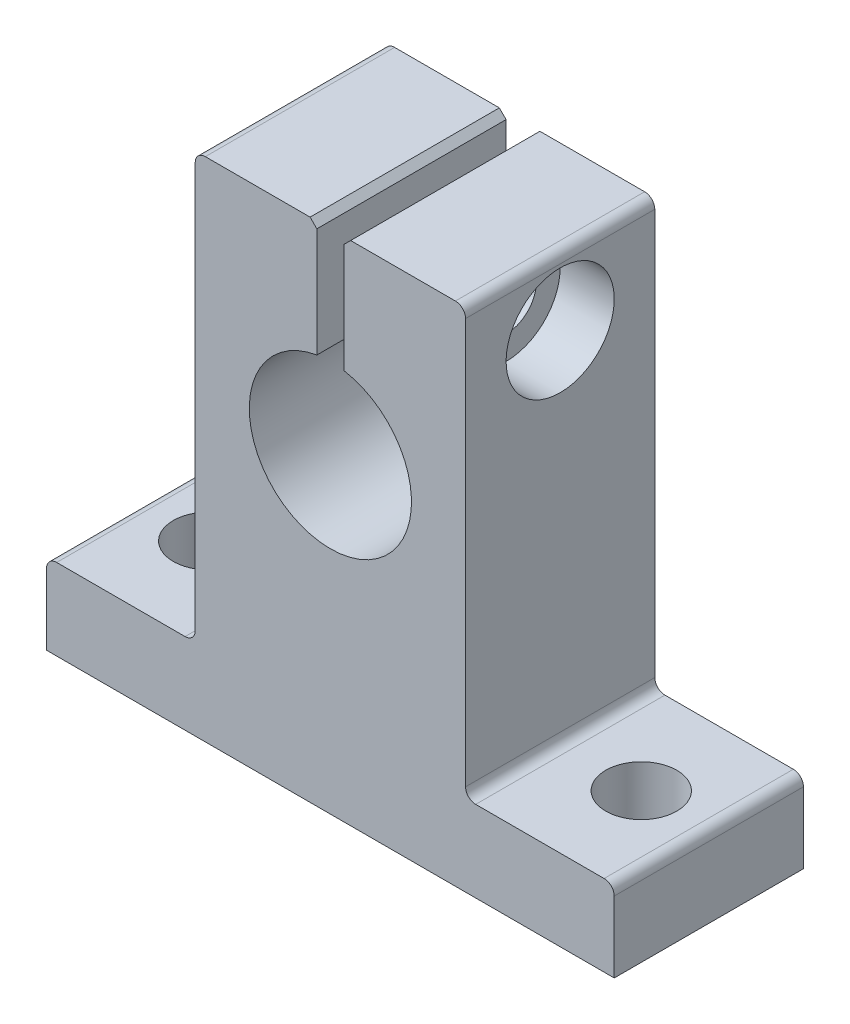
ISO-10303-21;
HEADER;
FILE_DESCRIPTION(('STEP AP214'),'2;1');
FILE_NAME('part.step','',(''),(''),'','','');
FILE_SCHEMA(('AUTOMOTIVE_DESIGN { 1 0 10303 214 1 1 1 1 }'));
ENDSEC;
DATA;
#1=APPLICATION_CONTEXT('core data for automotive mechanical design processes');
#2=APPLICATION_PROTOCOL_DEFINITION('international standard','automotive_design',2000,#1);
#3=PRODUCT_CONTEXT('',#1,'mechanical');
#4=PRODUCT('Part','Part','',(#3));
#5=PRODUCT_RELATED_PRODUCT_CATEGORY('part','',(#4));
#6=PRODUCT_DEFINITION_FORMATION('','',#4);
#7=PRODUCT_DEFINITION_CONTEXT('part definition',#1,'design');
#8=PRODUCT_DEFINITION('design','',#6,#7);
#9=PRODUCT_DEFINITION_SHAPE('','',#8);
#10=(LENGTH_UNIT() NAMED_UNIT(*) SI_UNIT(.MILLI.,.METRE.));
#11=(NAMED_UNIT(*) PLANE_ANGLE_UNIT() SI_UNIT($,.RADIAN.));
#12=(NAMED_UNIT(*) SI_UNIT($,.STERADIAN.) SOLID_ANGLE_UNIT());
#13=UNCERTAINTY_MEASURE_WITH_UNIT(LENGTH_MEASURE(1.E-05),#10,'distance_accuracy_value','');
#14=(GEOMETRIC_REPRESENTATION_CONTEXT(3) GLOBAL_UNCERTAINTY_ASSIGNED_CONTEXT((#13)) GLOBAL_UNIT_ASSIGNED_CONTEXT((#10,
#11,#12)) REPRESENTATION_CONTEXT('',''));
#15=CARTESIAN_POINT('',(0.,0.,0.));
#16=DIRECTION('',(0.,0.,1.));
#17=DIRECTION('',(1.,0.,0.));
#18=AXIS2_PLACEMENT_3D('',#15,#16,#17);
#19=CARTESIAN_POINT('',(10.,0.,14.));
#20=DIRECTION('',(-1.,0.,0.));
#21=DIRECTION('',(0.,-1.,0.));
#22=AXIS2_PLACEMENT_3D('',#19,#20,#21);
#23=PLANE('',#22);
#24=DIRECTION('',(0.,1.,0.));
#25=VECTOR('',#24,1.);
#26=CARTESIAN_POINT('',(10.,0.,14.));
#27=LINE('',#26,#25);
#28=CARTESIAN_POINT('',(10.,6.75,14.));
#29=VERTEX_POINT('',#28);
#30=CARTESIAN_POINT('',(10.,36.75,14.));
#31=VERTEX_POINT('',#30);
#32=EDGE_CURVE('E235',#29,#31,#27,.T.);
#33=ORIENTED_EDGE('',*,*,#32,.F.);
#34=DIRECTION('',(0.,0.,-1.));
#35=VECTOR('',#34,1.);
#36=CARTESIAN_POINT('',(10.,6.75,0.));
#37=LINE('',#36,#35);
#38=CARTESIAN_POINT('',(10.,6.75,0.));
#39=VERTEX_POINT('',#38);
#40=EDGE_CURVE('E275',#29,#39,#37,.T.);
#41=ORIENTED_EDGE('',*,*,#40,.T.);
#42=DIRECTION('',(0.,1.,0.));
#43=VECTOR('',#42,1.);
#44=CARTESIAN_POINT('',(10.,0.,0.));
#45=LINE('',#44,#43);
#46=CARTESIAN_POINT('',(10.,36.75,0.));
#47=VERTEX_POINT('',#46);
#48=EDGE_CURVE('E264',#39,#47,#45,.T.);
#49=ORIENTED_EDGE('',*,*,#48,.T.);
#50=DIRECTION('',(0.,0.,-1.));
#51=VECTOR('',#50,1.);
#52=CARTESIAN_POINT('',(10.,36.75,14.));
#53=LINE('',#52,#51);
#54=EDGE_CURVE('E197',#47,#31,#53,.F.);
#55=ORIENTED_EDGE('',*,*,#54,.T.);
#56=EDGE_LOOP('',(#33,#41,#49,#55));
#57=FACE_BOUND('',#56,.T.);
#58=CARTESIAN_POINT('',(10.,32.5,7.));
#59=DIRECTION('',(-1.,0.,0.));
#60=DIRECTION('',(0.,-1.,0.));
#61=AXIS2_PLACEMENT_3D('',#58,#59,#60);
#62=CIRCLE('',#61,4.);
#63=CARTESIAN_POINT('',(10.,28.5,7.));
#64=VERTEX_POINT('',#63);
#65=EDGE_CURVE('E692',#64,#64,#62,.T.);
#66=ORIENTED_EDGE('',*,*,#65,.T.);
#67=EDGE_LOOP('',(#66));
#68=FACE_BOUND('',#67,.T.);
#69=ADVANCED_FACE('F51',(#57,#68),#23,.F.);
#70=CARTESIAN_POINT('',(0.,23.,14.));
#71=DIRECTION('',(0.,0.,-1.));
#72=DIRECTION('',(-1.,0.,0.));
#73=AXIS2_PLACEMENT_3D('',#70,#71,#72);
#74=CYLINDRICAL_SURFACE('',#73,6.);
#75=CARTESIAN_POINT('',(0.,23.,0.));
#76=DIRECTION('',(0.,0.,1.));
#77=DIRECTION('',(1.,0.,0.));
#78=AXIS2_PLACEMENT_3D('',#75,#76,#77);
#79=CIRCLE('',#78,6.);
#80=CARTESIAN_POINT('',(-0.999999999999999,28.9160797830996,0.));
#81=VERTEX_POINT('',#80);
#82=CARTESIAN_POINT('',(1.,28.9160797830996,0.));
#83=VERTEX_POINT('',#82);
#84=EDGE_CURVE('E195',#81,#83,#79,.T.);
#85=ORIENTED_EDGE('',*,*,#84,.F.);
#86=DIRECTION('',(0.,0.,-1.));
#87=VECTOR('',#86,1.);
#88=CARTESIAN_POINT('',(-0.999999999999999,28.9160797830996,14.));
#89=LINE('',#88,#87);
#90=CARTESIAN_POINT('',(-0.999999999999999,28.9160797830996,14.));
#91=VERTEX_POINT('',#90);
#92=EDGE_CURVE('E189',#91,#81,#89,.T.);
#93=ORIENTED_EDGE('',*,*,#92,.F.);
#94=CARTESIAN_POINT('',(0.,23.,14.));
#95=DIRECTION('',(0.,0.,1.));
#96=DIRECTION('',(1.,0.,0.));
#97=AXIS2_PLACEMENT_3D('',#94,#95,#96);
#98=CIRCLE('',#97,6.);
#99=CARTESIAN_POINT('',(1.,28.9160797830996,14.));
#100=VERTEX_POINT('',#99);
#101=EDGE_CURVE('E193',#91,#100,#98,.T.);
#102=ORIENTED_EDGE('',*,*,#101,.T.);
#103=DIRECTION('',(0.,0.,-1.));
#104=VECTOR('',#103,1.);
#105=CARTESIAN_POINT('',(1.,28.9160797830996,14.));
#106=LINE('',#105,#104);
#107=EDGE_CURVE('E241',#100,#83,#106,.T.);
#108=ORIENTED_EDGE('',*,*,#107,.T.);
#109=EDGE_LOOP('',(#85,#93,#102,#108));
#110=FACE_BOUND('',#109,.T.);
#111=ADVANCED_FACE('F190',(#110),#74,.F.);
#112=CARTESIAN_POINT('',(-0.999999999999999,0.,14.));
#113=DIRECTION('',(-1.,0.,0.));
#114=DIRECTION('',(0.,0.,1.));
#115=AXIS2_PLACEMENT_3D('',#112,#113,#114);
#116=PLANE('',#115);
#117=CARTESIAN_POINT('',(-0.999999999999998,32.5,7.));
#118=DIRECTION('',(1.,0.,0.));
#119=DIRECTION('',(0.,0.,-1.));
#120=AXIS2_PLACEMENT_3D('',#117,#118,#119);
#121=CIRCLE('',#120,1.64999999999999);
#122=CARTESIAN_POINT('',(-0.999999999999998,32.5,5.35000000000001));
#123=VERTEX_POINT('',#122);
#124=EDGE_CURVE('E675',#123,#123,#121,.T.);
#125=ORIENTED_EDGE('',*,*,#124,.F.);
#126=EDGE_LOOP('',(#125));
#127=FACE_BOUND('',#126,.T.);
#128=DIRECTION('',(0.,1.,0.));
#129=VECTOR('',#128,1.);
#130=CARTESIAN_POINT('',(-0.999999999999999,0.,0.));
#131=LINE('',#130,#129);
#132=CARTESIAN_POINT('',(-0.999999999999999,37.,0.));
#133=VERTEX_POINT('',#132);
#134=EDGE_CURVE('E243',#81,#133,#131,.T.);
#135=ORIENTED_EDGE('',*,*,#134,.T.);
#136=DIRECTION('',(0.,0.,1.));
#137=VECTOR('',#136,1.);
#138=CARTESIAN_POINT('',(-0.999999999999999,37.,14.));
#139=LINE('',#138,#137);
#140=CARTESIAN_POINT('',(-0.999999999999998,37.,14.));
#141=VERTEX_POINT('',#140);
#142=EDGE_CURVE('E13',#133,#141,#139,.T.);
#143=ORIENTED_EDGE('',*,*,#142,.T.);
#144=DIRECTION('',(0.,1.,0.));
#145=VECTOR('',#144,1.);
#146=CARTESIAN_POINT('',(-0.999999999999999,0.,14.));
#147=LINE('',#146,#145);
#148=EDGE_CURVE('E200',#91,#141,#147,.T.);
#149=ORIENTED_EDGE('',*,*,#148,.F.);
#150=ORIENTED_EDGE('',*,*,#92,.T.);
#151=EDGE_LOOP('',(#135,#143,#149,#150));
#152=FACE_BOUND('',#151,.T.);
#153=ADVANCED_FACE('F201',(#127,#152),#116,.F.);
#154=CARTESIAN_POINT('',(0.,37.5,14.));
#155=DIRECTION('',(0.,-1.,0.));
#156=DIRECTION('',(1.,0.,0.));
#157=AXIS2_PLACEMENT_3D('',#154,#155,#156);
#158=PLANE('',#157);
#159=DIRECTION('',(-1.,0.,0.));
#160=VECTOR('',#159,1.);
#161=CARTESIAN_POINT('',(0.,37.5,14.));
#162=LINE('',#161,#160);
#163=CARTESIAN_POINT('',(-1.5,37.5,14.));
#164=VERTEX_POINT('',#163);
#165=CARTESIAN_POINT('',(-9.24999999999998,37.5,14.));
#166=VERTEX_POINT('',#165);
#167=EDGE_CURVE('E202',#164,#166,#162,.T.);
#168=ORIENTED_EDGE('',*,*,#167,.F.);
#169=DIRECTION('',(0.,0.,-1.));
#170=VECTOR('',#169,1.);
#171=CARTESIAN_POINT('',(-1.49999999999999,37.5,14.));
#172=LINE('',#171,#170);
#173=CARTESIAN_POINT('',(-1.49999999999999,37.5,0.));
#174=VERTEX_POINT('',#173);
#175=EDGE_CURVE('E60',#164,#174,#172,.T.);
#176=ORIENTED_EDGE('',*,*,#175,.T.);
#177=DIRECTION('',(-1.,0.,0.));
#178=VECTOR('',#177,1.);
#179=CARTESIAN_POINT('',(0.,37.5,0.));
#180=LINE('',#179,#178);
#181=CARTESIAN_POINT('',(-9.24999999999998,37.5,0.));
#182=VERTEX_POINT('',#181);
#183=EDGE_CURVE('E245',#174,#182,#180,.T.);
#184=ORIENTED_EDGE('',*,*,#183,.T.);
#185=DIRECTION('',(0.,0.,-1.));
#186=VECTOR('',#185,1.);
#187=CARTESIAN_POINT('',(-9.24999999999998,37.5,14.));
#188=LINE('',#187,#186);
#189=EDGE_CURVE('E318',#182,#166,#188,.F.);
#190=ORIENTED_EDGE('',*,*,#189,.T.);
#191=EDGE_LOOP('',(#168,#176,#184,#190));
#192=FACE_BOUND('',#191,.T.);
#193=ADVANCED_FACE('F345',(#192),#158,.F.);
#194=CARTESIAN_POINT('',(-10.,0.,14.));
#195=DIRECTION('',(-1.,0.,0.));
#196=DIRECTION('',(0.,-1.,0.));
#197=AXIS2_PLACEMENT_3D('',#194,#195,#196);
#198=PLANE('',#197);
#199=CARTESIAN_POINT('',(-9.99999999999999,32.5,7.));
#200=DIRECTION('',(-1.,0.,0.));
#201=DIRECTION('',(0.,-1.,0.));
#202=AXIS2_PLACEMENT_3D('',#199,#200,#201);
#203=CIRCLE('',#202,1.64999999999999);
#204=CARTESIAN_POINT('',(-9.99999999999999,30.85,7.));
#205=VERTEX_POINT('',#204);
#206=EDGE_CURVE('E214',#205,#205,#203,.T.);
#207=ORIENTED_EDGE('',*,*,#206,.F.);
#208=EDGE_LOOP('',(#207));
#209=FACE_BOUND('',#208,.T.);
#210=DIRECTION('',(0.,1.,0.));
#211=VECTOR('',#210,1.);
#212=CARTESIAN_POINT('',(-10.,0.,0.));
#213=LINE('',#212,#211);
#214=CARTESIAN_POINT('',(-10.,6.75,0.));
#215=VERTEX_POINT('',#214);
#216=CARTESIAN_POINT('',(-9.99999999999998,36.75,0.));
#217=VERTEX_POINT('',#216);
#218=EDGE_CURVE('E247',#215,#217,#213,.T.);
#219=ORIENTED_EDGE('',*,*,#218,.F.);
#220=DIRECTION('',(0.,0.,-1.));
#221=VECTOR('',#220,1.);
#222=CARTESIAN_POINT('',(-10.,6.75,14.));
#223=LINE('',#222,#221);
#224=CARTESIAN_POINT('',(-10.,6.75,14.));
#225=VERTEX_POINT('',#224);
#226=EDGE_CURVE('E291',#215,#225,#223,.F.);
#227=ORIENTED_EDGE('',*,*,#226,.T.);
#228=DIRECTION('',(0.,1.,0.));
#229=VECTOR('',#228,1.);
#230=CARTESIAN_POINT('',(-10.,0.,14.));
#231=LINE('',#230,#229);
#232=CARTESIAN_POINT('',(-9.99999999999998,36.75,14.));
#233=VERTEX_POINT('',#232);
#234=EDGE_CURVE('E218',#225,#233,#231,.T.);
#235=ORIENTED_EDGE('',*,*,#234,.T.);
#236=DIRECTION('',(0.,0.,-1.));
#237=VECTOR('',#236,1.);
#238=CARTESIAN_POINT('',(-9.99999999999998,36.75,0.));
#239=LINE('',#238,#237);
#240=EDGE_CURVE('E288',#233,#217,#239,.T.);
#241=ORIENTED_EDGE('',*,*,#240,.T.);
#242=EDGE_LOOP('',(#219,#227,#235,#241));
#243=FACE_BOUND('',#242,.T.);
#244=ADVANCED_FACE('F359',(#209,#243),#198,.T.);
#245=CARTESIAN_POINT('',(0.,5.99999999999998,14.));
#246=DIRECTION('',(0.,1.,0.));
#247=DIRECTION('',(-1.,0.,0.));
#248=AXIS2_PLACEMENT_3D('',#245,#246,#247);
#249=PLANE('',#248);
#250=CARTESIAN_POINT('',(-16.,6.00000000000001,7.));
#251=DIRECTION('',(0.,1.,0.));
#252=DIRECTION('',(-1.,0.,0.));
#253=AXIS2_PLACEMENT_3D('',#250,#251,#252);
#254=CIRCLE('',#253,2.625);
#255=CARTESIAN_POINT('',(-18.625,6.00000000000001,7.));
#256=VERTEX_POINT('',#255);
#257=EDGE_CURVE('E678',#256,#256,#254,.T.);
#258=ORIENTED_EDGE('',*,*,#257,.F.);
#259=EDGE_LOOP('',(#258));
#260=FACE_BOUND('',#259,.T.);
#261=DIRECTION('',(1.,0.,0.));
#262=VECTOR('',#261,1.);
#263=CARTESIAN_POINT('',(0.,5.99999999999998,14.));
#264=LINE('',#263,#262);
#265=CARTESIAN_POINT('',(-20.25,6.00000000000001,14.));
#266=VERTEX_POINT('',#265);
#267=CARTESIAN_POINT('',(-10.75,6.,14.));
#268=VERTEX_POINT('',#267);
#269=EDGE_CURVE('E221',#266,#268,#264,.T.);
#270=ORIENTED_EDGE('',*,*,#269,.T.);
#271=DIRECTION('',(0.,0.,-1.));
#272=VECTOR('',#271,1.);
#273=CARTESIAN_POINT('',(-10.75,6.,0.));
#274=LINE('',#273,#272);
#275=CARTESIAN_POINT('',(-10.75,6.,0.));
#276=VERTEX_POINT('',#275);
#277=EDGE_CURVE('E285',#268,#276,#274,.T.);
#278=ORIENTED_EDGE('',*,*,#277,.T.);
#279=DIRECTION('',(1.,0.,0.));
#280=VECTOR('',#279,1.);
#281=CARTESIAN_POINT('',(0.,5.99999999999998,0.));
#282=LINE('',#281,#280);
#283=CARTESIAN_POINT('',(-20.25,6.00000000000001,0.));
#284=VERTEX_POINT('',#283);
#285=EDGE_CURVE('E250',#284,#276,#282,.T.);
#286=ORIENTED_EDGE('',*,*,#285,.F.);
#287=DIRECTION('',(0.,0.,-1.));
#288=VECTOR('',#287,1.);
#289=CARTESIAN_POINT('',(-20.25,6.00000000000001,14.));
#290=LINE('',#289,#288);
#291=EDGE_CURVE('E283',#284,#266,#290,.F.);
#292=ORIENTED_EDGE('',*,*,#291,.T.);
#293=EDGE_LOOP('',(#270,#278,#286,#292));
#294=FACE_BOUND('',#293,.T.);
#295=ADVANCED_FACE('F367',(#260,#294),#249,.T.);
#296=CARTESIAN_POINT('',(-21.,0.,14.));
#297=DIRECTION('',(-1.,0.,0.));
#298=DIRECTION('',(0.,0.,1.));
#299=AXIS2_PLACEMENT_3D('',#296,#297,#298);
#300=PLANE('',#299);
#301=DIRECTION('',(0.,1.,0.));
#302=VECTOR('',#301,1.);
#303=CARTESIAN_POINT('',(-21.,0.,14.));
#304=LINE('',#303,#302);
#305=CARTESIAN_POINT('',(-21.,0.,14.));
#306=VERTEX_POINT('',#305);
#307=CARTESIAN_POINT('',(-21.,5.25000000000001,14.));
#308=VERTEX_POINT('',#307);
#309=EDGE_CURVE('E224',#306,#308,#304,.T.);
#310=ORIENTED_EDGE('',*,*,#309,.T.);
#311=DIRECTION('',(0.,0.,-1.));
#312=VECTOR('',#311,1.);
#313=CARTESIAN_POINT('',(-21.,5.25000000000001,14.));
#314=LINE('',#313,#312);
#315=CARTESIAN_POINT('',(-21.,5.25000000000001,0.));
#316=VERTEX_POINT('',#315);
#317=EDGE_CURVE('E293',#308,#316,#314,.T.);
#318=ORIENTED_EDGE('',*,*,#317,.T.);
#319=DIRECTION('',(0.,1.,0.));
#320=VECTOR('',#319,1.);
#321=CARTESIAN_POINT('',(-21.,0.,0.));
#322=LINE('',#321,#320);
#323=CARTESIAN_POINT('',(-21.,0.,0.));
#324=VERTEX_POINT('',#323);
#325=EDGE_CURVE('E253',#324,#316,#322,.T.);
#326=ORIENTED_EDGE('',*,*,#325,.F.);
#327=DIRECTION('',(0.,0.,-1.));
#328=VECTOR('',#327,1.);
#329=CARTESIAN_POINT('',(-21.,0.,14.));
#330=LINE('',#329,#328);
#331=EDGE_CURVE('E198',#306,#324,#330,.T.);
#332=ORIENTED_EDGE('',*,*,#331,.F.);
#333=EDGE_LOOP('',(#310,#318,#326,#332));
#334=FACE_BOUND('',#333,.T.);
#335=ADVANCED_FACE('F375',(#334),#300,.T.);
#336=CARTESIAN_POINT('',(0.,0.,14.));
#337=DIRECTION('',(0.,1.,0.));
#338=DIRECTION('',(-1.,0.,0.));
#339=AXIS2_PLACEMENT_3D('',#336,#337,#338);
#340=PLANE('',#339);
#341=CARTESIAN_POINT('',(16.,0.,7.));
#342=DIRECTION('',(0.,1.,0.));
#343=DIRECTION('',(-1.,0.,0.));
#344=AXIS2_PLACEMENT_3D('',#341,#342,#343);
#345=CIRCLE('',#344,2.625);
#346=CARTESIAN_POINT('',(13.375,0.,7.));
#347=VERTEX_POINT('',#346);
#348=EDGE_CURVE('E683',#347,#347,#345,.F.);
#349=ORIENTED_EDGE('',*,*,#348,.F.);
#350=EDGE_LOOP('',(#349));
#351=FACE_BOUND('',#350,.T.);
#352=CARTESIAN_POINT('',(-16.,0.,7.));
#353=DIRECTION('',(0.,1.,0.));
#354=DIRECTION('',(-1.,0.,0.));
#355=AXIS2_PLACEMENT_3D('',#352,#353,#354);
#356=CIRCLE('',#355,2.625);
#357=CARTESIAN_POINT('',(-18.625,0.,7.));
#358=VERTEX_POINT('',#357);
#359=EDGE_CURVE('E676',#358,#358,#356,.F.);
#360=ORIENTED_EDGE('',*,*,#359,.F.);
#361=EDGE_LOOP('',(#360));
#362=FACE_BOUND('',#361,.T.);
#363=DIRECTION('',(1.,0.,0.));
#364=VECTOR('',#363,1.);
#365=CARTESIAN_POINT('',(0.,0.,0.));
#366=LINE('',#365,#364);
#367=CARTESIAN_POINT('',(21.,0.,0.));
#368=VERTEX_POINT('',#367);
#369=EDGE_CURVE('E256',#324,#368,#366,.T.);
#370=ORIENTED_EDGE('',*,*,#369,.T.);
#371=DIRECTION('',(0.,0.,-1.));
#372=VECTOR('',#371,1.);
#373=CARTESIAN_POINT('',(21.,0.,14.));
#374=LINE('',#373,#372);
#375=CARTESIAN_POINT('',(21.,0.,14.));
#376=VERTEX_POINT('',#375);
#377=EDGE_CURVE('E270',#376,#368,#374,.T.);
#378=ORIENTED_EDGE('',*,*,#377,.F.);
#379=DIRECTION('',(1.,0.,0.));
#380=VECTOR('',#379,1.);
#381=CARTESIAN_POINT('',(0.,0.,14.));
#382=LINE('',#381,#380);
#383=EDGE_CURVE('E227',#306,#376,#382,.T.);
#384=ORIENTED_EDGE('',*,*,#383,.F.);
#385=ORIENTED_EDGE('',*,*,#331,.T.);
#386=EDGE_LOOP('',(#370,#378,#384,#385));
#387=FACE_BOUND('',#386,.T.);
#388=ADVANCED_FACE('F381',(#351,#362,#387),#340,.F.);
#389=CARTESIAN_POINT('',(21.,0.,14.));
#390=DIRECTION('',(-1.,0.,0.));
#391=DIRECTION('',(0.,0.,1.));
#392=AXIS2_PLACEMENT_3D('',#389,#390,#391);
#393=PLANE('',#392);
#394=DIRECTION('',(0.,1.,0.));
#395=VECTOR('',#394,1.);
#396=CARTESIAN_POINT('',(21.,0.,0.));
#397=LINE('',#396,#395);
#398=CARTESIAN_POINT('',(21.,5.25,0.));
#399=VERTEX_POINT('',#398);
#400=EDGE_CURVE('E258',#368,#399,#397,.T.);
#401=ORIENTED_EDGE('',*,*,#400,.T.);
#402=DIRECTION('',(0.,0.,-1.));
#403=VECTOR('',#402,1.);
#404=CARTESIAN_POINT('',(21.,5.25,14.));
#405=LINE('',#404,#403);
#406=CARTESIAN_POINT('',(21.,5.25,14.));
#407=VERTEX_POINT('',#406);
#408=EDGE_CURVE('E313',#399,#407,#405,.F.);
#409=ORIENTED_EDGE('',*,*,#408,.T.);
#410=DIRECTION('',(0.,1.,0.));
#411=VECTOR('',#410,1.);
#412=CARTESIAN_POINT('',(21.,0.,14.));
#413=LINE('',#412,#411);
#414=EDGE_CURVE('E229',#376,#407,#413,.T.);
#415=ORIENTED_EDGE('',*,*,#414,.F.);
#416=ORIENTED_EDGE('',*,*,#377,.T.);
#417=EDGE_LOOP('',(#401,#409,#415,#416));
#418=FACE_BOUND('',#417,.T.);
#419=ADVANCED_FACE('F439',(#418),#393,.F.);
#420=CARTESIAN_POINT('',(0.,5.99999999999999,14.));
#421=DIRECTION('',(0.,-1.,0.));
#422=DIRECTION('',(1.,0.,0.));
#423=AXIS2_PLACEMENT_3D('',#420,#421,#422);
#424=PLANE('',#423);
#425=CARTESIAN_POINT('',(16.,5.99999999999996,7.));
#426=DIRECTION('',(0.,1.,0.));
#427=DIRECTION('',(1.,0.,0.));
#428=AXIS2_PLACEMENT_3D('',#425,#426,#427);
#429=CIRCLE('',#428,2.625);
#430=CARTESIAN_POINT('',(18.625,5.99999999999995,7.));
#431=VERTEX_POINT('',#430);
#432=EDGE_CURVE('E686',#431,#431,#429,.T.);
#433=ORIENTED_EDGE('',*,*,#432,.F.);
#434=EDGE_LOOP('',(#433));
#435=FACE_BOUND('',#434,.T.);
#436=DIRECTION('',(-1.,0.,0.));
#437=VECTOR('',#436,1.);
#438=CARTESIAN_POINT('',(0.,5.99999999999999,0.));
#439=LINE('',#438,#437);
#440=CARTESIAN_POINT('',(20.25,6.,0.));
#441=VERTEX_POINT('',#440);
#442=CARTESIAN_POINT('',(10.75,6.,0.));
#443=VERTEX_POINT('',#442);
#444=EDGE_CURVE('E261',#441,#443,#439,.T.);
#445=ORIENTED_EDGE('',*,*,#444,.T.);
#446=DIRECTION('',(0.,0.,-1.));
#447=VECTOR('',#446,1.);
#448=CARTESIAN_POINT('',(10.75,6.,14.));
#449=LINE('',#448,#447);
#450=CARTESIAN_POINT('',(10.75,6.,14.));
#451=VERTEX_POINT('',#450);
#452=EDGE_CURVE('E281',#443,#451,#449,.F.);
#453=ORIENTED_EDGE('',*,*,#452,.T.);
#454=DIRECTION('',(-1.,0.,0.));
#455=VECTOR('',#454,1.);
#456=CARTESIAN_POINT('',(0.,5.99999999999999,14.));
#457=LINE('',#456,#455);
#458=CARTESIAN_POINT('',(20.25,6.,14.));
#459=VERTEX_POINT('',#458);
#460=EDGE_CURVE('E232',#459,#451,#457,.T.);
#461=ORIENTED_EDGE('',*,*,#460,.F.);
#462=DIRECTION('',(0.,0.,-1.));
#463=VECTOR('',#462,1.);
#464=CARTESIAN_POINT('',(20.25,6.,14.));
#465=LINE('',#464,#463);
#466=EDGE_CURVE('E278',#459,#441,#465,.T.);
#467=ORIENTED_EDGE('',*,*,#466,.T.);
#468=EDGE_LOOP('',(#445,#453,#461,#467));
#469=FACE_BOUND('',#468,.T.);
#470=ADVANCED_FACE('F392',(#435,#469),#424,.F.);
#471=CARTESIAN_POINT('',(0.,37.5,14.));
#472=DIRECTION('',(0.,-1.,0.));
#473=DIRECTION('',(1.,0.,0.));
#474=AXIS2_PLACEMENT_3D('',#471,#472,#473);
#475=PLANE('',#474);
#476=DIRECTION('',(-1.,0.,0.));
#477=VECTOR('',#476,1.);
#478=CARTESIAN_POINT('',(0.,37.5,0.));
#479=LINE('',#478,#477);
#480=CARTESIAN_POINT('',(9.25,37.5,0.));
#481=VERTEX_POINT('',#480);
#482=CARTESIAN_POINT('',(1.49999999999999,37.5,0.));
#483=VERTEX_POINT('',#482);
#484=EDGE_CURVE('E211',#481,#483,#479,.T.);
#485=ORIENTED_EDGE('',*,*,#484,.T.);
#486=DIRECTION('',(0.,0.,1.));
#487=VECTOR('',#486,1.);
#488=CARTESIAN_POINT('',(1.49999999999999,37.5,14.));
#489=LINE('',#488,#487);
#490=CARTESIAN_POINT('',(1.5,37.5,14.));
#491=VERTEX_POINT('',#490);
#492=EDGE_CURVE('E336',#483,#491,#489,.T.);
#493=ORIENTED_EDGE('',*,*,#492,.T.);
#494=DIRECTION('',(-1.,0.,0.));
#495=VECTOR('',#494,1.);
#496=CARTESIAN_POINT('',(0.,37.5,14.));
#497=LINE('',#496,#495);
#498=CARTESIAN_POINT('',(9.25,37.5,14.));
#499=VERTEX_POINT('',#498);
#500=EDGE_CURVE('E238',#499,#491,#497,.T.);
#501=ORIENTED_EDGE('',*,*,#500,.F.);
#502=DIRECTION('',(0.,0.,-1.));
#503=VECTOR('',#502,1.);
#504=CARTESIAN_POINT('',(9.25,37.5,14.));
#505=LINE('',#504,#503);
#506=EDGE_CURVE('E315',#499,#481,#505,.T.);
#507=ORIENTED_EDGE('',*,*,#506,.T.);
#508=EDGE_LOOP('',(#485,#493,#501,#507));
#509=FACE_BOUND('',#508,.T.);
#510=ADVANCED_FACE('F411',(#509),#475,.F.);
#511=CARTESIAN_POINT('',(1.00000000000001,0.,14.));
#512=DIRECTION('',(1.,0.,0.));
#513=DIRECTION('',(0.,1.,0.));
#514=AXIS2_PLACEMENT_3D('',#511,#512,#513);
#515=PLANE('',#514);
#516=CARTESIAN_POINT('',(1.,32.5,7.));
#517=DIRECTION('',(1.,0.,0.));
#518=DIRECTION('',(0.,1.,0.));
#519=AXIS2_PLACEMENT_3D('',#516,#517,#518);
#520=CIRCLE('',#519,2.25);
#521=CARTESIAN_POINT('',(1.,34.75,7.));
#522=VERTEX_POINT('',#521);
#523=EDGE_CURVE('E689',#522,#522,#520,.F.);
#524=ORIENTED_EDGE('',*,*,#523,.F.);
#525=EDGE_LOOP('',(#524));
#526=FACE_BOUND('',#525,.T.);
#527=DIRECTION('',(0.,-1.,0.));
#528=VECTOR('',#527,1.);
#529=CARTESIAN_POINT('',(1.00000000000001,0.,14.));
#530=LINE('',#529,#528);
#531=CARTESIAN_POINT('',(0.999999999999998,37.,14.));
#532=VERTEX_POINT('',#531);
#533=EDGE_CURVE('E207',#532,#100,#530,.T.);
#534=ORIENTED_EDGE('',*,*,#533,.F.);
#535=DIRECTION('',(0.,0.,-1.));
#536=VECTOR('',#535,1.);
#537=CARTESIAN_POINT('',(0.999999999999999,37.,14.));
#538=LINE('',#537,#536);
#539=CARTESIAN_POINT('',(0.999999999999997,37.,0.));
#540=VERTEX_POINT('',#539);
#541=EDGE_CURVE('E329',#532,#540,#538,.T.);
#542=ORIENTED_EDGE('',*,*,#541,.T.);
#543=DIRECTION('',(0.,-1.,0.));
#544=VECTOR('',#543,1.);
#545=CARTESIAN_POINT('',(1.00000000000001,0.,0.));
#546=LINE('',#545,#544);
#547=EDGE_CURVE('E209',#540,#83,#546,.T.);
#548=ORIENTED_EDGE('',*,*,#547,.T.);
#549=ORIENTED_EDGE('',*,*,#107,.F.);
#550=EDGE_LOOP('',(#534,#542,#548,#549));
#551=FACE_BOUND('',#550,.T.);
#552=ADVANCED_FACE('F418',(#526,#551),#515,.F.);
#553=CARTESIAN_POINT('',(0.,0.,14.));
#554=DIRECTION('',(0.,0.,1.));
#555=DIRECTION('',(1.,0.,0.));
#556=AXIS2_PLACEMENT_3D('',#553,#554,#555);
#557=PLANE('',#556);
#558=ORIENTED_EDGE('',*,*,#500,.T.);
#559=DIRECTION('',(0.707106781186543,0.707106781186552,0.));
#560=VECTOR('',#559,1.);
#561=CARTESIAN_POINT('',(-18.,17.9999999999997,14.));
#562=LINE('',#561,#560);
#563=EDGE_CURVE('E339',#491,#532,#562,.F.);
#564=ORIENTED_EDGE('',*,*,#563,.T.);
#565=ORIENTED_EDGE('',*,*,#533,.T.);
#566=ORIENTED_EDGE('',*,*,#101,.F.);
#567=ORIENTED_EDGE('',*,*,#148,.T.);
#568=DIRECTION('',(0.707106781186543,-0.707106781186552,0.));
#569=VECTOR('',#568,1.);
#570=CARTESIAN_POINT('',(18.,17.9999999999997,14.));
#571=LINE('',#570,#569);
#572=EDGE_CURVE('E67',#141,#164,#571,.F.);
#573=ORIENTED_EDGE('',*,*,#572,.T.);
#574=ORIENTED_EDGE('',*,*,#167,.T.);
#575=CARTESIAN_POINT('',(-9.24999999999998,36.75,14.));
#576=DIRECTION('',(0.,0.,1.));
#577=DIRECTION('',(1.,0.,0.));
#578=AXIS2_PLACEMENT_3D('',#575,#576,#577);
#579=CIRCLE('',#578,0.75);
#580=EDGE_CURVE('E305',#166,#233,#579,.T.);
#581=ORIENTED_EDGE('',*,*,#580,.T.);
#582=ORIENTED_EDGE('',*,*,#234,.F.);
#583=CARTESIAN_POINT('',(-10.75,6.75,14.));
#584=DIRECTION('',(0.,0.,1.));
#585=DIRECTION('',(1.,0.,0.));
#586=AXIS2_PLACEMENT_3D('',#583,#584,#585);
#587=CIRCLE('',#586,0.75);
#588=EDGE_CURVE('E327',#225,#268,#587,.F.);
#589=ORIENTED_EDGE('',*,*,#588,.T.);
#590=ORIENTED_EDGE('',*,*,#269,.F.);
#591=CARTESIAN_POINT('',(-20.25,5.25000000000001,14.));
#592=DIRECTION('',(0.,0.,1.));
#593=DIRECTION('',(1.,0.,0.));
#594=AXIS2_PLACEMENT_3D('',#591,#592,#593);
#595=CIRCLE('',#594,0.75);
#596=EDGE_CURVE('E311',#266,#308,#595,.T.);
#597=ORIENTED_EDGE('',*,*,#596,.T.);
#598=ORIENTED_EDGE('',*,*,#309,.F.);
#599=ORIENTED_EDGE('',*,*,#383,.T.);
#600=ORIENTED_EDGE('',*,*,#414,.T.);
#601=CARTESIAN_POINT('',(20.25,5.25,14.));
#602=DIRECTION('',(0.,0.,1.));
#603=DIRECTION('',(1.,0.,0.));
#604=AXIS2_PLACEMENT_3D('',#601,#602,#603);
#605=CIRCLE('',#604,0.75);
#606=EDGE_CURVE('E309',#407,#459,#605,.T.);
#607=ORIENTED_EDGE('',*,*,#606,.T.);
#608=ORIENTED_EDGE('',*,*,#460,.T.);
#609=CARTESIAN_POINT('',(10.75,6.75,14.));
#610=DIRECTION('',(0.,0.,1.));
#611=DIRECTION('',(1.,0.,0.));
#612=AXIS2_PLACEMENT_3D('',#609,#610,#611);
#613=CIRCLE('',#612,0.75);
#614=EDGE_CURVE('E323',#451,#29,#613,.F.);
#615=ORIENTED_EDGE('',*,*,#614,.T.);
#616=ORIENTED_EDGE('',*,*,#32,.T.);
#617=CARTESIAN_POINT('',(9.25,36.75,14.));
#618=DIRECTION('',(0.,0.,1.));
#619=DIRECTION('',(1.,0.,0.));
#620=AXIS2_PLACEMENT_3D('',#617,#618,#619);
#621=CIRCLE('',#620,0.75);
#622=EDGE_CURVE('E307',#31,#499,#621,.T.);
#623=ORIENTED_EDGE('',*,*,#622,.T.);
#624=EDGE_LOOP('',(#558,#564,#565,#566,#567,#573,#574,#581,#582,#589,#590,#597,#598,#599,#600,
#607,#608,#615,#616,#623));
#625=FACE_BOUND('',#624,.T.);
#626=ADVANCED_FACE('F205',(#625),#557,.T.);
#627=CARTESIAN_POINT('',(0.,0.,0.));
#628=DIRECTION('',(0.,0.,1.));
#629=DIRECTION('',(1.,0.,0.));
#630=AXIS2_PLACEMENT_3D('',#627,#628,#629);
#631=PLANE('',#630);
#632=ORIENTED_EDGE('',*,*,#547,.F.);
#633=DIRECTION('',(-0.707106781186543,-0.707106781186552,0.));
#634=VECTOR('',#633,1.);
#635=CARTESIAN_POINT('',(0.999999999999999,37.,0.));
#636=LINE('',#635,#634);
#637=EDGE_CURVE('E334',#540,#483,#636,.F.);
#638=ORIENTED_EDGE('',*,*,#637,.T.);
#639=ORIENTED_EDGE('',*,*,#484,.F.);
#640=CARTESIAN_POINT('',(9.25,36.75,0.));
#641=DIRECTION('',(0.,0.,1.));
#642=DIRECTION('',(1.,0.,0.));
#643=AXIS2_PLACEMENT_3D('',#640,#641,#642);
#644=CIRCLE('',#643,0.75);
#645=EDGE_CURVE('E299',#481,#47,#644,.F.);
#646=ORIENTED_EDGE('',*,*,#645,.T.);
#647=ORIENTED_EDGE('',*,*,#48,.F.);
#648=CARTESIAN_POINT('',(10.75,6.75,0.));
#649=DIRECTION('',(0.,0.,1.));
#650=DIRECTION('',(1.,0.,0.));
#651=AXIS2_PLACEMENT_3D('',#648,#649,#650);
#652=CIRCLE('',#651,0.75);
#653=EDGE_CURVE('E321',#39,#443,#652,.T.);
#654=ORIENTED_EDGE('',*,*,#653,.T.);
#655=ORIENTED_EDGE('',*,*,#444,.F.);
#656=CARTESIAN_POINT('',(20.25,5.25,0.));
#657=DIRECTION('',(0.,0.,1.));
#658=DIRECTION('',(1.,0.,0.));
#659=AXIS2_PLACEMENT_3D('',#656,#657,#658);
#660=CIRCLE('',#659,0.75);
#661=EDGE_CURVE('E301',#441,#399,#660,.F.);
#662=ORIENTED_EDGE('',*,*,#661,.T.);
#663=ORIENTED_EDGE('',*,*,#400,.F.);
#664=ORIENTED_EDGE('',*,*,#369,.F.);
#665=ORIENTED_EDGE('',*,*,#325,.T.);
#666=CARTESIAN_POINT('',(-20.25,5.25000000000001,0.));
#667=DIRECTION('',(0.,0.,1.));
#668=DIRECTION('',(1.,0.,0.));
#669=AXIS2_PLACEMENT_3D('',#666,#667,#668);
#670=CIRCLE('',#669,0.75);
#671=EDGE_CURVE('E303',#316,#284,#670,.F.);
#672=ORIENTED_EDGE('',*,*,#671,.T.);
#673=ORIENTED_EDGE('',*,*,#285,.T.);
#674=CARTESIAN_POINT('',(-10.75,6.75,0.));
#675=DIRECTION('',(0.,0.,1.));
#676=DIRECTION('',(1.,0.,0.));
#677=AXIS2_PLACEMENT_3D('',#674,#675,#676);
#678=CIRCLE('',#677,0.75);
#679=EDGE_CURVE('E325',#276,#215,#678,.T.);
#680=ORIENTED_EDGE('',*,*,#679,.T.);
#681=ORIENTED_EDGE('',*,*,#218,.T.);
#682=CARTESIAN_POINT('',(-9.24999999999998,36.75,0.));
#683=DIRECTION('',(0.,0.,1.));
#684=DIRECTION('',(1.,0.,0.));
#685=AXIS2_PLACEMENT_3D('',#682,#683,#684);
#686=CIRCLE('',#685,0.75);
#687=EDGE_CURVE('E296',#217,#182,#686,.F.);
#688=ORIENTED_EDGE('',*,*,#687,.T.);
#689=ORIENTED_EDGE('',*,*,#183,.F.);
#690=DIRECTION('',(-0.707106781186543,0.707106781186552,0.));
#691=VECTOR('',#690,1.);
#692=CARTESIAN_POINT('',(-1.49999999999999,37.5,0.));
#693=LINE('',#692,#691);
#694=EDGE_CURVE('E332',#174,#133,#693,.F.);
#695=ORIENTED_EDGE('',*,*,#694,.T.);
#696=ORIENTED_EDGE('',*,*,#134,.F.);
#697=ORIENTED_EDGE('',*,*,#84,.T.);
#698=EDGE_LOOP('',(#632,#638,#639,#646,#647,#654,#655,#662,#663,#664,#665,#672,#673,#680,#681,
#688,#689,#695,#696,#697));
#699=FACE_BOUND('',#698,.T.);
#700=ADVANCED_FACE('F349',(#699),#631,.F.);
#701=CARTESIAN_POINT('',(-0.999999999999999,32.5,7.));
#702=DIRECTION('',(1.,0.,0.));
#703=DIRECTION('',(0.,0.,-1.));
#704=AXIS2_PLACEMENT_3D('',#701,#702,#703);
#705=CYLINDRICAL_SURFACE('',#704,1.64999999999999);
#706=ORIENTED_EDGE('',*,*,#206,.T.);
#707=EDGE_LOOP('',(#706));
#708=FACE_BOUND('',#707,.T.);
#709=ORIENTED_EDGE('',*,*,#124,.T.);
#710=EDGE_LOOP('',(#709));
#711=FACE_BOUND('',#710,.T.);
#712=ADVANCED_FACE('F543',(#708,#711),#705,.F.);
#713=CARTESIAN_POINT('',(-16.,-0.00100000000000794,7.));
#714=DIRECTION('',(0.,1.,0.));
#715=DIRECTION('',(-1.,0.,0.));
#716=AXIS2_PLACEMENT_3D('',#713,#714,#715);
#717=CYLINDRICAL_SURFACE('',#716,2.625);
#718=ORIENTED_EDGE('',*,*,#257,.T.);
#719=EDGE_LOOP('',(#718));
#720=FACE_BOUND('',#719,.T.);
#721=ORIENTED_EDGE('',*,*,#359,.T.);
#722=EDGE_LOOP('',(#721));
#723=FACE_BOUND('',#722,.T.);
#724=ADVANCED_FACE('F539',(#720,#723),#717,.F.);
#725=CARTESIAN_POINT('',(16.,-0.00100000000005825,7.));
#726=DIRECTION('',(0.,1.,0.));
#727=DIRECTION('',(-1.,0.,0.));
#728=AXIS2_PLACEMENT_3D('',#725,#726,#727);
#729=CYLINDRICAL_SURFACE('',#728,2.625);
#730=ORIENTED_EDGE('',*,*,#432,.T.);
#731=EDGE_LOOP('',(#730));
#732=FACE_BOUND('',#731,.T.);
#733=ORIENTED_EDGE('',*,*,#348,.T.);
#734=EDGE_LOOP('',(#733));
#735=FACE_BOUND('',#734,.T.);
#736=ADVANCED_FACE('F461',(#732,#735),#729,.F.);
#737=CARTESIAN_POINT('',(10.75,6.75,14.));
#738=DIRECTION('',(0.,0.,1.));
#739=DIRECTION('',(1.,0.,0.));
#740=AXIS2_PLACEMENT_3D('',#737,#738,#739);
#741=CYLINDRICAL_SURFACE('',#740,0.75);
#742=ORIENTED_EDGE('',*,*,#614,.F.);
#743=ORIENTED_EDGE('',*,*,#452,.F.);
#744=ORIENTED_EDGE('',*,*,#653,.F.);
#745=ORIENTED_EDGE('',*,*,#40,.F.);
#746=EDGE_LOOP('',(#742,#743,#744,#745));
#747=FACE_BOUND('',#746,.T.);
#748=ADVANCED_FACE('F399',(#747),#741,.F.);
#749=CARTESIAN_POINT('',(-10.75,6.75,14.));
#750=DIRECTION('',(0.,0.,1.));
#751=DIRECTION('',(1.,0.,0.));
#752=AXIS2_PLACEMENT_3D('',#749,#750,#751);
#753=CYLINDRICAL_SURFACE('',#752,0.75);
#754=ORIENTED_EDGE('',*,*,#588,.F.);
#755=ORIENTED_EDGE('',*,*,#226,.F.);
#756=ORIENTED_EDGE('',*,*,#679,.F.);
#757=ORIENTED_EDGE('',*,*,#277,.F.);
#758=EDGE_LOOP('',(#754,#755,#756,#757));
#759=FACE_BOUND('',#758,.T.);
#760=ADVANCED_FACE('F362',(#759),#753,.F.);
#761=CARTESIAN_POINT('',(-20.25,5.25000000000001,14.));
#762=DIRECTION('',(0.,0.,-1.));
#763=DIRECTION('',(-1.,0.,0.));
#764=AXIS2_PLACEMENT_3D('',#761,#762,#763);
#765=CYLINDRICAL_SURFACE('',#764,0.75);
#766=ORIENTED_EDGE('',*,*,#596,.F.);
#767=ORIENTED_EDGE('',*,*,#291,.F.);
#768=ORIENTED_EDGE('',*,*,#671,.F.);
#769=ORIENTED_EDGE('',*,*,#317,.F.);
#770=EDGE_LOOP('',(#766,#767,#768,#769));
#771=FACE_BOUND('',#770,.T.);
#772=ADVANCED_FACE('F371',(#771),#765,.T.);
#773=CARTESIAN_POINT('',(20.25,5.25,14.));
#774=DIRECTION('',(0.,0.,-1.));
#775=DIRECTION('',(-1.,0.,0.));
#776=AXIS2_PLACEMENT_3D('',#773,#774,#775);
#777=CYLINDRICAL_SURFACE('',#776,0.75);
#778=ORIENTED_EDGE('',*,*,#606,.F.);
#779=ORIENTED_EDGE('',*,*,#408,.F.);
#780=ORIENTED_EDGE('',*,*,#661,.F.);
#781=ORIENTED_EDGE('',*,*,#466,.F.);
#782=EDGE_LOOP('',(#778,#779,#780,#781));
#783=FACE_BOUND('',#782,.T.);
#784=ADVANCED_FACE('F389',(#783),#777,.T.);
#785=CARTESIAN_POINT('',(9.25,36.75,14.));
#786=DIRECTION('',(0.,0.,-1.));
#787=DIRECTION('',(-1.,0.,0.));
#788=AXIS2_PLACEMENT_3D('',#785,#786,#787);
#789=CYLINDRICAL_SURFACE('',#788,0.75);
#790=ORIENTED_EDGE('',*,*,#622,.F.);
#791=ORIENTED_EDGE('',*,*,#54,.F.);
#792=ORIENTED_EDGE('',*,*,#645,.F.);
#793=ORIENTED_EDGE('',*,*,#506,.F.);
#794=EDGE_LOOP('',(#790,#791,#792,#793));
#795=FACE_BOUND('',#794,.T.);
#796=ADVANCED_FACE('F408',(#795),#789,.T.);
#797=CARTESIAN_POINT('',(-9.24999999999998,36.75,14.));
#798=DIRECTION('',(0.,0.,1.));
#799=DIRECTION('',(1.,0.,0.));
#800=AXIS2_PLACEMENT_3D('',#797,#798,#799);
#801=CYLINDRICAL_SURFACE('',#800,0.75);
#802=ORIENTED_EDGE('',*,*,#580,.F.);
#803=ORIENTED_EDGE('',*,*,#189,.F.);
#804=ORIENTED_EDGE('',*,*,#687,.F.);
#805=ORIENTED_EDGE('',*,*,#240,.F.);
#806=EDGE_LOOP('',(#802,#803,#804,#805));
#807=FACE_BOUND('',#806,.T.);
#808=ADVANCED_FACE('F355',(#807),#801,.T.);
#809=CARTESIAN_POINT('',(0.999999999999999,37.,14.));
#810=DIRECTION('',(0.707106781186552,-0.707106781186543,0.));
#811=DIRECTION('',(0.,0.,-1.));
#812=AXIS2_PLACEMENT_3D('',#809,#810,#811);
#813=PLANE('',#812);
#814=ORIENTED_EDGE('',*,*,#563,.F.);
#815=ORIENTED_EDGE('',*,*,#492,.F.);
#816=ORIENTED_EDGE('',*,*,#637,.F.);
#817=ORIENTED_EDGE('',*,*,#541,.F.);
#818=EDGE_LOOP('',(#814,#815,#816,#817));
#819=FACE_BOUND('',#818,.T.);
#820=ADVANCED_FACE('F416',(#819),#813,.F.);
#821=CARTESIAN_POINT('',(-1.49999999999999,37.5,14.));
#822=DIRECTION('',(-0.707106781186552,-0.707106781186543,0.));
#823=DIRECTION('',(0.,0.,-1.));
#824=AXIS2_PLACEMENT_3D('',#821,#822,#823);
#825=PLANE('',#824);
#826=ORIENTED_EDGE('',*,*,#572,.F.);
#827=ORIENTED_EDGE('',*,*,#142,.F.);
#828=ORIENTED_EDGE('',*,*,#694,.F.);
#829=ORIENTED_EDGE('',*,*,#175,.F.);
#830=EDGE_LOOP('',(#826,#827,#828,#829));
#831=FACE_BOUND('',#830,.T.);
#832=ADVANCED_FACE('F53',(#831),#825,.F.);
#833=CARTESIAN_POINT('',(-21.001,32.5,7.));
#834=DIRECTION('',(1.,0.,0.));
#835=DIRECTION('',(0.,1.,0.));
#836=AXIS2_PLACEMENT_3D('',#833,#834,#835);
#837=CYLINDRICAL_SURFACE('',#836,2.25);
#838=CARTESIAN_POINT('',(6.,32.5,7.));
#839=DIRECTION('',(-1.,0.,0.));
#840=DIRECTION('',(0.,-1.,0.));
#841=AXIS2_PLACEMENT_3D('',#838,#839,#840);
#842=CIRCLE('',#841,2.25);
#843=CARTESIAN_POINT('',(6.,30.25,7.));
#844=VERTEX_POINT('',#843);
#845=EDGE_CURVE('E55',#844,#844,#842,.F.);
#846=ORIENTED_EDGE('',*,*,#845,.T.);
#847=EDGE_LOOP('',(#846));
#848=FACE_BOUND('',#847,.T.);
#849=ORIENTED_EDGE('',*,*,#523,.T.);
#850=EDGE_LOOP('',(#849));
#851=FACE_BOUND('',#850,.T.);
#852=ADVANCED_FACE('F420',(#848,#851),#837,.F.);
#853=CARTESIAN_POINT('',(6.,32.5,7.));
#854=DIRECTION('',(-1.,0.,0.));
#855=DIRECTION('',(0.,-1.,0.));
#856=AXIS2_PLACEMENT_3D('',#853,#854,#855);
#857=PLANE('',#856);
#858=CARTESIAN_POINT('',(6.,32.5,7.));
#859=DIRECTION('',(-1.,0.,0.));
#860=DIRECTION('',(0.,-1.,0.));
#861=AXIS2_PLACEMENT_3D('',#858,#859,#860);
#862=CIRCLE('',#861,4.);
#863=CARTESIAN_POINT('',(6.,28.5,7.));
#864=VERTEX_POINT('',#863);
#865=EDGE_CURVE('E695',#864,#864,#862,.T.);
#866=ORIENTED_EDGE('',*,*,#865,.F.);
#867=EDGE_LOOP('',(#866));
#868=FACE_BOUND('',#867,.T.);
#869=ORIENTED_EDGE('',*,*,#845,.F.);
#870=EDGE_LOOP('',(#869));
#871=FACE_BOUND('',#870,.T.);
#872=ADVANCED_FACE('F425',(#868,#871),#857,.F.);
#873=CARTESIAN_POINT('',(6.,32.5,7.));
#874=DIRECTION('',(1.,0.,0.));
#875=DIRECTION('',(0.,1.,0.));
#876=AXIS2_PLACEMENT_3D('',#873,#874,#875);
#877=CYLINDRICAL_SURFACE('',#876,4.);
#878=ORIENTED_EDGE('',*,*,#865,.T.);
#879=EDGE_LOOP('',(#878));
#880=FACE_BOUND('',#879,.T.);
#881=ORIENTED_EDGE('',*,*,#65,.F.);
#882=EDGE_LOOP('',(#881));
#883=FACE_BOUND('',#882,.T.);
#884=ADVANCED_FACE('F520',(#880,#883),#877,.F.);
#885=CLOSED_SHELL('',(#69,#111,#153,#193,#244,#295,#335,#388,#419,#470,#510,#552,#626,#700,#712,
#724,#736,#748,#760,#772,#784,#796,#808,#820,#832,#852,#872,#884));
#886=MANIFOLD_SOLID_BREP('B2',#885);
#887=ADVANCED_BREP_SHAPE_REPRESENTATION('',(#18,#886),#14);
#888=SHAPE_DEFINITION_REPRESENTATION(#9,#887);
ENDSEC;
END-ISO-10303-21;
